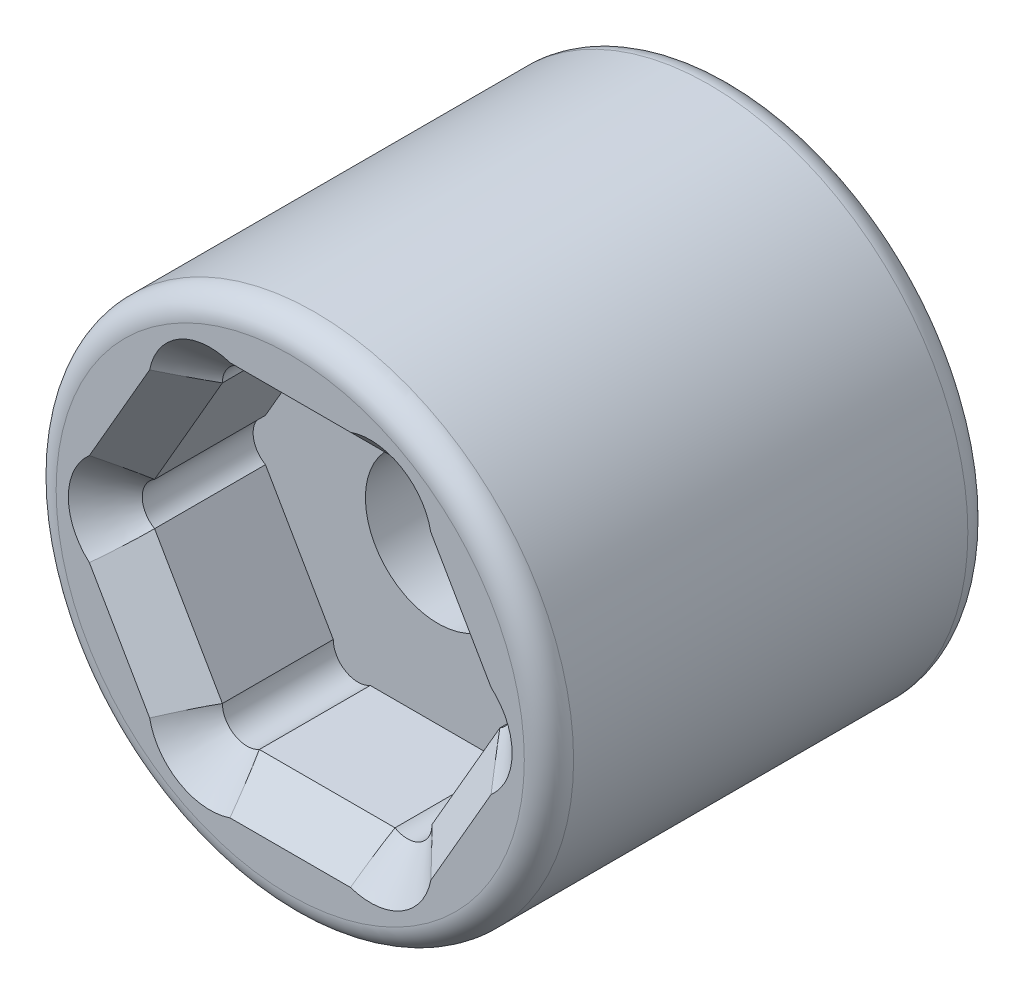
ISO-10303-21;
HEADER;
FILE_DESCRIPTION(('STEP AP214'),'2;1');
FILE_NAME('part.step','',(''),(''),'','','');
FILE_SCHEMA(('AUTOMOTIVE_DESIGN { 1 0 10303 214 1 1 1 1 }'));
ENDSEC;
DATA;
#1=APPLICATION_CONTEXT('core data for automotive mechanical design processes');
#2=APPLICATION_PROTOCOL_DEFINITION('international standard','automotive_design',2000,#1);
#3=PRODUCT_CONTEXT('',#1,'mechanical');
#4=PRODUCT('Part','Part','',(#3));
#5=PRODUCT_RELATED_PRODUCT_CATEGORY('part','',(#4));
#6=PRODUCT_DEFINITION_FORMATION('','',#4);
#7=PRODUCT_DEFINITION_CONTEXT('part definition',#1,'design');
#8=PRODUCT_DEFINITION('design','',#6,#7);
#9=PRODUCT_DEFINITION_SHAPE('','',#8);
#10=(LENGTH_UNIT() NAMED_UNIT(*) SI_UNIT(.MILLI.,.METRE.));
#11=(NAMED_UNIT(*) PLANE_ANGLE_UNIT() SI_UNIT($,.RADIAN.));
#12=(NAMED_UNIT(*) SI_UNIT($,.STERADIAN.) SOLID_ANGLE_UNIT());
#13=UNCERTAINTY_MEASURE_WITH_UNIT(LENGTH_MEASURE(1.E-05),#10,'distance_accuracy_value','');
#14=(GEOMETRIC_REPRESENTATION_CONTEXT(3) GLOBAL_UNCERTAINTY_ASSIGNED_CONTEXT((#13)) GLOBAL_UNIT_ASSIGNED_CONTEXT((#10,
#11,#12)) REPRESENTATION_CONTEXT('',''));
#15=CARTESIAN_POINT('',(0.,0.,0.));
#16=DIRECTION('',(0.,0.,1.));
#17=DIRECTION('',(1.,0.,0.));
#18=AXIS2_PLACEMENT_3D('',#15,#16,#17);
#19=CARTESIAN_POINT('',(0.,0.,6.));
#20=DIRECTION('',(0.,0.,1.));
#21=DIRECTION('',(1.,0.,0.));
#22=AXIS2_PLACEMENT_3D('',#19,#20,#21);
#23=PLANE('',#22);
#24=CARTESIAN_POINT('',(0.,0.,6.));
#25=DIRECTION('',(0.,0.,1.));
#26=DIRECTION('',(1.,0.,0.));
#27=AXIS2_PLACEMENT_3D('',#24,#25,#26);
#28=CIRCLE('',#27,9.5);
#29=CARTESIAN_POINT('',(9.5,0.,6.));
#30=VERTEX_POINT('',#29);
#31=EDGE_CURVE('E259',#30,#30,#28,.T.);
#32=ORIENTED_EDGE('',*,*,#31,.T.);
#33=EDGE_LOOP('',(#32));
#34=FACE_BOUND('',#33,.T.);
#35=DIRECTION('',(1.,0.,0.));
#36=VECTOR('',#35,1.);
#37=CARTESIAN_POINT('',(0.,8.00000000000001,6.));
#38=LINE('',#37,#36);
#39=CARTESIAN_POINT('',(-2.44535877331225,8.00000000000001,6.));
#40=VERTEX_POINT('',#39);
#41=CARTESIAN_POINT('',(2.44535877331225,8.00000000000001,6.));
#42=VERTEX_POINT('',#41);
#43=EDGE_CURVE('E208',#40,#42,#38,.T.);
#44=ORIENTED_EDGE('',*,*,#43,.T.);
#45=CARTESIAN_POINT('',(3.25277674973257,5.63397459621556,6.));
#46=DIRECTION('',(0.,0.,1.));
#47=DIRECTION('',(1.,0.,0.));
#48=AXIS2_PLACEMENT_3D('',#45,#46,#47);
#49=CIRCLE('',#48,2.50000000000001);
#50=CARTESIAN_POINT('',(5.70552384361939,6.11774281905556,6.));
#51=VERTEX_POINT('',#50);
#52=EDGE_CURVE('E230',#42,#51,#49,.F.);
#53=ORIENTED_EDGE('',*,*,#52,.T.);
#54=DIRECTION('',(0.5,-0.866025403784439,0.));
#55=VECTOR('',#54,1.);
#56=CARTESIAN_POINT('',(6.92820323027551,4.00000000000001,6.));
#57=LINE('',#56,#55);
#58=CARTESIAN_POINT('',(8.15088261693164,1.88225718094445,6.));
#59=VERTEX_POINT('',#58);
#60=EDGE_CURVE('E228',#51,#59,#57,.T.);
#61=ORIENTED_EDGE('',*,*,#60,.T.);
#62=CARTESIAN_POINT('',(6.50555349946513,0.,6.));
#63=DIRECTION('',(0.,0.,1.));
#64=DIRECTION('',(1.,0.,0.));
#65=AXIS2_PLACEMENT_3D('',#62,#63,#64);
#66=CIRCLE('',#65,2.50000000000001);
#67=CARTESIAN_POINT('',(8.15088261693164,-1.88225718094445,6.));
#68=VERTEX_POINT('',#67);
#69=EDGE_CURVE('E226',#59,#68,#66,.F.);
#70=ORIENTED_EDGE('',*,*,#69,.T.);
#71=DIRECTION('',(-0.5,-0.866025403784439,0.));
#72=VECTOR('',#71,1.);
#73=CARTESIAN_POINT('',(6.92820323027552,-4.,6.));
#74=LINE('',#73,#72);
#75=CARTESIAN_POINT('',(5.7055238436194,-6.11774281905555,6.));
#76=VERTEX_POINT('',#75);
#77=EDGE_CURVE('E224',#68,#76,#74,.T.);
#78=ORIENTED_EDGE('',*,*,#77,.T.);
#79=CARTESIAN_POINT('',(3.25277674973257,-5.63397459621556,6.));
#80=DIRECTION('',(0.,0.,1.));
#81=DIRECTION('',(1.,0.,0.));
#82=AXIS2_PLACEMENT_3D('',#79,#80,#81);
#83=CIRCLE('',#82,2.50000000000001);
#84=CARTESIAN_POINT('',(2.44535877331225,-8.00000000000001,6.));
#85=VERTEX_POINT('',#84);
#86=EDGE_CURVE('E222',#76,#85,#83,.F.);
#87=ORIENTED_EDGE('',*,*,#86,.T.);
#88=DIRECTION('',(-1.,0.,0.));
#89=VECTOR('',#88,1.);
#90=CARTESIAN_POINT('',(0.,-8.00000000000001,6.));
#91=LINE('',#90,#89);
#92=CARTESIAN_POINT('',(-2.44535877331224,-8.00000000000001,6.));
#93=VERTEX_POINT('',#92);
#94=EDGE_CURVE('E220',#85,#93,#91,.T.);
#95=ORIENTED_EDGE('',*,*,#94,.T.);
#96=CARTESIAN_POINT('',(-3.25277674973256,-5.63397459621556,6.));
#97=DIRECTION('',(0.,0.,1.));
#98=DIRECTION('',(1.,0.,0.));
#99=AXIS2_PLACEMENT_3D('',#96,#97,#98);
#100=CIRCLE('',#99,2.50000000000001);
#101=CARTESIAN_POINT('',(-5.70552384361939,-6.11774281905556,6.));
#102=VERTEX_POINT('',#101);
#103=EDGE_CURVE('E218',#93,#102,#100,.F.);
#104=ORIENTED_EDGE('',*,*,#103,.T.);
#105=DIRECTION('',(-0.5,0.866025403784439,0.));
#106=VECTOR('',#105,1.);
#107=CARTESIAN_POINT('',(-6.92820323027552,-4.00000000000001,6.));
#108=LINE('',#107,#106);
#109=CARTESIAN_POINT('',(-8.15088261693163,-1.88225718094446,6.));
#110=VERTEX_POINT('',#109);
#111=EDGE_CURVE('E216',#102,#110,#108,.T.);
#112=ORIENTED_EDGE('',*,*,#111,.T.);
#113=CARTESIAN_POINT('',(-6.50555349946513,0.,6.));
#114=DIRECTION('',(0.,0.,1.));
#115=DIRECTION('',(1.,0.,0.));
#116=AXIS2_PLACEMENT_3D('',#113,#114,#115);
#117=CIRCLE('',#116,2.50000000000001);
#118=CARTESIAN_POINT('',(-8.15088261693164,1.88225718094444,6.));
#119=VERTEX_POINT('',#118);
#120=EDGE_CURVE('E214',#110,#119,#117,.F.);
#121=ORIENTED_EDGE('',*,*,#120,.T.);
#122=DIRECTION('',(0.5,0.866025403784439,0.));
#123=VECTOR('',#122,1.);
#124=CARTESIAN_POINT('',(-6.92820323027552,4.,6.));
#125=LINE('',#124,#123);
#126=CARTESIAN_POINT('',(-5.70552384361939,6.11774281905556,6.));
#127=VERTEX_POINT('',#126);
#128=EDGE_CURVE('E212',#119,#127,#125,.T.);
#129=ORIENTED_EDGE('',*,*,#128,.T.);
#130=CARTESIAN_POINT('',(-3.25277674973257,5.63397459621556,6.));
#131=DIRECTION('',(0.,0.,1.));
#132=DIRECTION('',(1.,0.,0.));
#133=AXIS2_PLACEMENT_3D('',#130,#131,#132);
#134=CIRCLE('',#133,2.50000000000001);
#135=EDGE_CURVE('E210',#127,#40,#134,.F.);
#136=ORIENTED_EDGE('',*,*,#135,.T.);
#137=EDGE_LOOP('',(#44,#53,#61,#70,#78,#87,#95,#104,#112,#121,#129,#136));
#138=FACE_BOUND('',#137,.T.);
#139=ADVANCED_FACE('F34',(#34,#138),#23,.T.);
#140=CARTESIAN_POINT('',(0.,0.,6.));
#141=DIRECTION('',(0.,0.,-1.));
#142=DIRECTION('',(-1.,0.,0.));
#143=AXIS2_PLACEMENT_3D('',#140,#141,#142);
#144=CYLINDRICAL_SURFACE('',#143,10.5);
#145=CARTESIAN_POINT('',(0.,0.,5.));
#146=DIRECTION('',(0.,0.,1.));
#147=DIRECTION('',(1.,0.,0.));
#148=AXIS2_PLACEMENT_3D('',#145,#146,#147);
#149=CIRCLE('',#148,10.5);
#150=CARTESIAN_POINT('',(10.5,0.,5.));
#151=VERTEX_POINT('',#150);
#152=EDGE_CURVE('E42',#151,#151,#149,.F.);
#153=ORIENTED_EDGE('',*,*,#152,.T.);
#154=EDGE_LOOP('',(#153));
#155=FACE_BOUND('',#154,.T.);
#156=CARTESIAN_POINT('',(0.,0.,-11.));
#157=DIRECTION('',(0.,0.,-1.));
#158=DIRECTION('',(-1.,0.,0.));
#159=AXIS2_PLACEMENT_3D('',#156,#157,#158);
#160=CIRCLE('',#159,10.5);
#161=CARTESIAN_POINT('',(-10.5,0.,-11.));
#162=VERTEX_POINT('',#161);
#163=EDGE_CURVE('E396',#162,#162,#160,.F.);
#164=ORIENTED_EDGE('',*,*,#163,.T.);
#165=EDGE_LOOP('',(#164));
#166=FACE_BOUND('',#165,.T.);
#167=ADVANCED_FACE('F401',(#155,#166),#144,.T.);
#168=CARTESIAN_POINT('',(-3.25277674973257,5.63397459621556,6.));
#169=DIRECTION('',(0.,0.,-1.));
#170=DIRECTION('',(-1.,0.,0.));
#171=AXIS2_PLACEMENT_3D('',#168,#169,#170);
#172=CYLINDRICAL_SURFACE('',#171,1.);
#173=DIRECTION('',(0.,0.,-1.));
#174=VECTOR('',#173,1.);
#175=CARTESIAN_POINT('',(-2.75277674973257,6.5,6.));
#176=LINE('',#175,#174);
#177=CARTESIAN_POINT('',(-2.75277674973257,6.5,4.5));
#178=VERTEX_POINT('',#177);
#179=CARTESIAN_POINT('',(-2.75277674973257,6.5,0.));
#180=VERTEX_POINT('',#179);
#181=EDGE_CURVE('E158',#178,#180,#176,.T.);
#182=ORIENTED_EDGE('',*,*,#181,.F.);
#183=CARTESIAN_POINT('',(-3.25277674973257,5.63397459621556,4.5));
#184=DIRECTION('',(0.,0.,1.));
#185=DIRECTION('',(1.,0.,0.));
#186=AXIS2_PLACEMENT_3D('',#183,#184,#185);
#187=CIRCLE('',#186,1.);
#188=CARTESIAN_POINT('',(-4.25277674973257,5.63397459621556,4.5));
#189=VERTEX_POINT('',#188);
#190=EDGE_CURVE('E56',#178,#189,#187,.T.);
#191=ORIENTED_EDGE('',*,*,#190,.T.);
#192=DIRECTION('',(0.,0.,-1.));
#193=VECTOR('',#192,1.);
#194=CARTESIAN_POINT('',(-4.25277674973257,5.63397459621556,6.));
#195=LINE('',#194,#193);
#196=CARTESIAN_POINT('',(-4.25277674973257,5.63397459621556,0.));
#197=VERTEX_POINT('',#196);
#198=EDGE_CURVE('E169',#189,#197,#195,.T.);
#199=ORIENTED_EDGE('',*,*,#198,.T.);
#200=CARTESIAN_POINT('',(-3.25277674973257,5.63397459621556,0.));
#201=DIRECTION('',(0.,0.,1.));
#202=DIRECTION('',(-1.,0.,0.));
#203=AXIS2_PLACEMENT_3D('',#200,#201,#202);
#204=CIRCLE('',#203,1.);
#205=EDGE_CURVE('E167',#180,#197,#204,.T.);
#206=ORIENTED_EDGE('',*,*,#205,.F.);
#207=EDGE_LOOP('',(#182,#191,#199,#206));
#208=FACE_BOUND('',#207,.T.);
#209=ADVANCED_FACE('F168',(#208),#172,.F.);
#210=CARTESIAN_POINT('',(-7.00555349946513,0.866025403784436,6.));
#211=DIRECTION('',(0.866025403784439,-0.5,0.));
#212=DIRECTION('',(0.5,0.866025403784439,0.));
#213=AXIS2_PLACEMENT_3D('',#210,#211,#212);
#214=PLANE('',#213);
#215=ORIENTED_EDGE('',*,*,#198,.F.);
#216=DIRECTION('',(-0.5,-0.866025403784439,0.));
#217=VECTOR('',#216,1.);
#218=CARTESIAN_POINT('',(-7.00555349946513,0.866025403784436,4.5));
#219=LINE('',#218,#217);
#220=CARTESIAN_POINT('',(-7.00555349946513,0.866025403784436,4.5));
#221=VERTEX_POINT('',#220);
#222=EDGE_CURVE('E249',#189,#221,#219,.T.);
#223=ORIENTED_EDGE('',*,*,#222,.T.);
#224=DIRECTION('',(0.,0.,-1.));
#225=VECTOR('',#224,1.);
#226=CARTESIAN_POINT('',(-7.00555349946513,0.866025403784436,6.));
#227=LINE('',#226,#225);
#228=CARTESIAN_POINT('',(-7.00555349946513,0.866025403784436,0.));
#229=VERTEX_POINT('',#228);
#230=EDGE_CURVE('E202',#221,#229,#227,.T.);
#231=ORIENTED_EDGE('',*,*,#230,.T.);
#232=DIRECTION('',(-0.5,-0.866025403784439,0.));
#233=VECTOR('',#232,1.);
#234=CARTESIAN_POINT('',(-7.00555349946513,0.866025403784436,0.));
#235=LINE('',#234,#233);
#236=EDGE_CURVE('E173',#197,#229,#235,.T.);
#237=ORIENTED_EDGE('',*,*,#236,.F.);
#238=EDGE_LOOP('',(#215,#223,#231,#237));
#239=FACE_BOUND('',#238,.T.);
#240=ADVANCED_FACE('F677',(#239),#214,.T.);
#241=CARTESIAN_POINT('',(-6.50555349946513,0.,6.));
#242=DIRECTION('',(0.,0.,-1.));
#243=DIRECTION('',(-1.,0.,0.));
#244=AXIS2_PLACEMENT_3D('',#241,#242,#243);
#245=CYLINDRICAL_SURFACE('',#244,1.);
#246=ORIENTED_EDGE('',*,*,#230,.F.);
#247=CARTESIAN_POINT('',(-6.50555349946513,0.,4.5));
#248=DIRECTION('',(0.,0.,1.));
#249=DIRECTION('',(1.,0.,0.));
#250=AXIS2_PLACEMENT_3D('',#247,#248,#249);
#251=CIRCLE('',#250,1.);
#252=CARTESIAN_POINT('',(-7.00555349946513,-0.866025403784446,4.5));
#253=VERTEX_POINT('',#252);
#254=EDGE_CURVE('E247',#221,#253,#251,.T.);
#255=ORIENTED_EDGE('',*,*,#254,.T.);
#256=DIRECTION('',(0.,0.,-1.));
#257=VECTOR('',#256,1.);
#258=CARTESIAN_POINT('',(-7.00555349946513,-0.866025403784446,6.));
#259=LINE('',#258,#257);
#260=CARTESIAN_POINT('',(-7.00555349946513,-0.866025403784446,0.));
#261=VERTEX_POINT('',#260);
#262=EDGE_CURVE('E200',#253,#261,#259,.T.);
#263=ORIENTED_EDGE('',*,*,#262,.T.);
#264=CARTESIAN_POINT('',(-6.50555349946513,0.,0.));
#265=DIRECTION('',(0.,0.,1.));
#266=DIRECTION('',(-1.,0.,0.));
#267=AXIS2_PLACEMENT_3D('',#264,#265,#266);
#268=CIRCLE('',#267,1.);
#269=EDGE_CURVE('E723',#229,#261,#268,.T.);
#270=ORIENTED_EDGE('',*,*,#269,.F.);
#271=EDGE_LOOP('',(#246,#255,#263,#270));
#272=FACE_BOUND('',#271,.T.);
#273=ADVANCED_FACE('F668',(#272),#245,.F.);
#274=CARTESIAN_POINT('',(-4.25277674973256,-5.63397459621556,6.));
#275=DIRECTION('',(0.866025403784439,0.5,0.));
#276=DIRECTION('',(-0.5,0.866025403784439,0.));
#277=AXIS2_PLACEMENT_3D('',#274,#275,#276);
#278=PLANE('',#277);
#279=ORIENTED_EDGE('',*,*,#262,.F.);
#280=DIRECTION('',(0.5,-0.866025403784439,0.));
#281=VECTOR('',#280,1.);
#282=CARTESIAN_POINT('',(-4.25277674973256,-5.63397459621556,4.5));
#283=LINE('',#282,#281);
#284=CARTESIAN_POINT('',(-4.25277674973256,-5.63397459621556,4.5));
#285=VERTEX_POINT('',#284);
#286=EDGE_CURVE('E245',#253,#285,#283,.T.);
#287=ORIENTED_EDGE('',*,*,#286,.T.);
#288=DIRECTION('',(0.,0.,-1.));
#289=VECTOR('',#288,1.);
#290=CARTESIAN_POINT('',(-4.25277674973256,-5.63397459621556,6.));
#291=LINE('',#290,#289);
#292=CARTESIAN_POINT('',(-4.25277674973256,-5.63397459621556,0.));
#293=VERTEX_POINT('',#292);
#294=EDGE_CURVE('E198',#285,#293,#291,.T.);
#295=ORIENTED_EDGE('',*,*,#294,.T.);
#296=DIRECTION('',(0.5,-0.866025403784438,0.));
#297=VECTOR('',#296,1.);
#298=CARTESIAN_POINT('',(-4.25277674973256,-5.63397459621556,0.));
#299=LINE('',#298,#297);
#300=EDGE_CURVE('E725',#261,#293,#299,.T.);
#301=ORIENTED_EDGE('',*,*,#300,.F.);
#302=EDGE_LOOP('',(#279,#287,#295,#301));
#303=FACE_BOUND('',#302,.T.);
#304=ADVANCED_FACE('F659',(#303),#278,.T.);
#305=CARTESIAN_POINT('',(-3.25277674973256,-5.63397459621556,6.));
#306=DIRECTION('',(0.,0.,-1.));
#307=DIRECTION('',(-1.,0.,0.));
#308=AXIS2_PLACEMENT_3D('',#305,#306,#307);
#309=CYLINDRICAL_SURFACE('',#308,1.);
#310=ORIENTED_EDGE('',*,*,#294,.F.);
#311=CARTESIAN_POINT('',(-3.25277674973256,-5.63397459621556,4.5));
#312=DIRECTION('',(0.,0.,1.));
#313=DIRECTION('',(1.,0.,0.));
#314=AXIS2_PLACEMENT_3D('',#311,#312,#313);
#315=CIRCLE('',#314,1.);
#316=CARTESIAN_POINT('',(-2.75277674973256,-6.5,4.5));
#317=VERTEX_POINT('',#316);
#318=EDGE_CURVE('E243',#285,#317,#315,.T.);
#319=ORIENTED_EDGE('',*,*,#318,.T.);
#320=DIRECTION('',(0.,0.,-1.));
#321=VECTOR('',#320,1.);
#322=CARTESIAN_POINT('',(-2.75277674973256,-6.5,6.));
#323=LINE('',#322,#321);
#324=CARTESIAN_POINT('',(-2.75277674973256,-6.5,0.));
#325=VERTEX_POINT('',#324);
#326=EDGE_CURVE('E196',#317,#325,#323,.T.);
#327=ORIENTED_EDGE('',*,*,#326,.T.);
#328=CARTESIAN_POINT('',(-3.25277674973256,-5.63397459621556,0.));
#329=DIRECTION('',(0.,0.,1.));
#330=DIRECTION('',(-1.,0.,0.));
#331=AXIS2_PLACEMENT_3D('',#328,#329,#330);
#332=CIRCLE('',#331,1.);
#333=EDGE_CURVE('E731',#293,#325,#332,.T.);
#334=ORIENTED_EDGE('',*,*,#333,.F.);
#335=EDGE_LOOP('',(#310,#319,#327,#334));
#336=FACE_BOUND('',#335,.T.);
#337=ADVANCED_FACE('F650',(#336),#309,.F.);
#338=CARTESIAN_POINT('',(2.75277674973257,-6.5,6.));
#339=DIRECTION('',(0.,1.,0.));
#340=DIRECTION('',(-1.,0.,0.));
#341=AXIS2_PLACEMENT_3D('',#338,#339,#340);
#342=PLANE('',#341);
#343=ORIENTED_EDGE('',*,*,#326,.F.);
#344=DIRECTION('',(1.,0.,0.));
#345=VECTOR('',#344,1.);
#346=CARTESIAN_POINT('',(2.75277674973257,-6.5,4.5));
#347=LINE('',#346,#345);
#348=CARTESIAN_POINT('',(2.75277674973257,-6.5,4.5));
#349=VERTEX_POINT('',#348);
#350=EDGE_CURVE('E241',#317,#349,#347,.T.);
#351=ORIENTED_EDGE('',*,*,#350,.T.);
#352=DIRECTION('',(0.,0.,-1.));
#353=VECTOR('',#352,1.);
#354=CARTESIAN_POINT('',(2.75277674973257,-6.5,6.));
#355=LINE('',#354,#353);
#356=CARTESIAN_POINT('',(2.75277674973257,-6.5,0.));
#357=VERTEX_POINT('',#356);
#358=EDGE_CURVE('E194',#349,#357,#355,.T.);
#359=ORIENTED_EDGE('',*,*,#358,.T.);
#360=DIRECTION('',(1.,0.,0.));
#361=VECTOR('',#360,1.);
#362=CARTESIAN_POINT('',(2.75277674973257,-6.5,0.));
#363=LINE('',#362,#361);
#364=EDGE_CURVE('E734',#325,#357,#363,.T.);
#365=ORIENTED_EDGE('',*,*,#364,.F.);
#366=EDGE_LOOP('',(#343,#351,#359,#365));
#367=FACE_BOUND('',#366,.T.);
#368=ADVANCED_FACE('F641',(#367),#342,.T.);
#369=CARTESIAN_POINT('',(3.25277674973257,-5.63397459621556,6.));
#370=DIRECTION('',(0.,0.,-1.));
#371=DIRECTION('',(-1.,0.,0.));
#372=AXIS2_PLACEMENT_3D('',#369,#370,#371);
#373=CYLINDRICAL_SURFACE('',#372,1.);
#374=ORIENTED_EDGE('',*,*,#358,.F.);
#375=CARTESIAN_POINT('',(3.25277674973257,-5.63397459621556,4.5));
#376=DIRECTION('',(0.,0.,1.));
#377=DIRECTION('',(1.,0.,0.));
#378=AXIS2_PLACEMENT_3D('',#375,#376,#377);
#379=CIRCLE('',#378,1.);
#380=CARTESIAN_POINT('',(4.25277674973257,-5.63397459621556,4.5));
#381=VERTEX_POINT('',#380);
#382=EDGE_CURVE('E239',#349,#381,#379,.T.);
#383=ORIENTED_EDGE('',*,*,#382,.T.);
#384=DIRECTION('',(0.,0.,-1.));
#385=VECTOR('',#384,1.);
#386=CARTESIAN_POINT('',(4.25277674973257,-5.63397459621556,6.));
#387=LINE('',#386,#385);
#388=CARTESIAN_POINT('',(4.25277674973257,-5.63397459621556,0.));
#389=VERTEX_POINT('',#388);
#390=EDGE_CURVE('E192',#381,#389,#387,.T.);
#391=ORIENTED_EDGE('',*,*,#390,.T.);
#392=CARTESIAN_POINT('',(3.25277674973257,-5.63397459621556,0.));
#393=DIRECTION('',(0.,0.,1.));
#394=DIRECTION('',(-1.,0.,0.));
#395=AXIS2_PLACEMENT_3D('',#392,#393,#394);
#396=CIRCLE('',#395,1.);
#397=EDGE_CURVE('E737',#357,#389,#396,.T.);
#398=ORIENTED_EDGE('',*,*,#397,.F.);
#399=EDGE_LOOP('',(#374,#383,#391,#398));
#400=FACE_BOUND('',#399,.T.);
#401=ADVANCED_FACE('F632',(#400),#373,.F.);
#402=CARTESIAN_POINT('',(7.00555349946513,-0.866025403784438,6.));
#403=DIRECTION('',(-0.866025403784439,0.5,0.));
#404=DIRECTION('',(-0.5,-0.866025403784439,0.));
#405=AXIS2_PLACEMENT_3D('',#402,#403,#404);
#406=PLANE('',#405);
#407=ORIENTED_EDGE('',*,*,#390,.F.);
#408=DIRECTION('',(0.5,0.866025403784439,0.));
#409=VECTOR('',#408,1.);
#410=CARTESIAN_POINT('',(7.00555349946513,-0.866025403784438,4.5));
#411=LINE('',#410,#409);
#412=CARTESIAN_POINT('',(7.00555349946513,-0.866025403784438,4.5));
#413=VERTEX_POINT('',#412);
#414=EDGE_CURVE('E237',#381,#413,#411,.T.);
#415=ORIENTED_EDGE('',*,*,#414,.T.);
#416=DIRECTION('',(0.,0.,-1.));
#417=VECTOR('',#416,1.);
#418=CARTESIAN_POINT('',(7.00555349946513,-0.866025403784438,6.));
#419=LINE('',#418,#417);
#420=CARTESIAN_POINT('',(7.00555349946513,-0.866025403784438,0.));
#421=VERTEX_POINT('',#420);
#422=EDGE_CURVE('E190',#413,#421,#419,.T.);
#423=ORIENTED_EDGE('',*,*,#422,.T.);
#424=DIRECTION('',(0.5,0.866025403784439,0.));
#425=VECTOR('',#424,1.);
#426=CARTESIAN_POINT('',(7.00555349946513,-0.866025403784438,0.));
#427=LINE('',#426,#425);
#428=EDGE_CURVE('E740',#389,#421,#427,.T.);
#429=ORIENTED_EDGE('',*,*,#428,.F.);
#430=EDGE_LOOP('',(#407,#415,#423,#429));
#431=FACE_BOUND('',#430,.T.);
#432=ADVANCED_FACE('F623',(#431),#406,.T.);
#433=CARTESIAN_POINT('',(6.50555349946513,0.,6.));
#434=DIRECTION('',(0.,0.,-1.));
#435=DIRECTION('',(-1.,0.,0.));
#436=AXIS2_PLACEMENT_3D('',#433,#434,#435);
#437=CYLINDRICAL_SURFACE('',#436,1.);
#438=ORIENTED_EDGE('',*,*,#422,.F.);
#439=CARTESIAN_POINT('',(6.50555349946513,0.,4.5));
#440=DIRECTION('',(0.,0.,1.));
#441=DIRECTION('',(1.,0.,0.));
#442=AXIS2_PLACEMENT_3D('',#439,#440,#441);
#443=CIRCLE('',#442,1.);
#444=CARTESIAN_POINT('',(7.00555349946513,0.866025403784443,4.5));
#445=VERTEX_POINT('',#444);
#446=EDGE_CURVE('E235',#413,#445,#443,.T.);
#447=ORIENTED_EDGE('',*,*,#446,.T.);
#448=DIRECTION('',(0.,0.,-1.));
#449=VECTOR('',#448,1.);
#450=CARTESIAN_POINT('',(7.00555349946513,0.866025403784443,6.));
#451=LINE('',#450,#449);
#452=CARTESIAN_POINT('',(7.00555349946513,0.866025403784443,0.));
#453=VERTEX_POINT('',#452);
#454=EDGE_CURVE('E188',#445,#453,#451,.T.);
#455=ORIENTED_EDGE('',*,*,#454,.T.);
#456=CARTESIAN_POINT('',(6.50555349946513,0.,0.));
#457=DIRECTION('',(0.,0.,1.));
#458=DIRECTION('',(-1.,0.,0.));
#459=AXIS2_PLACEMENT_3D('',#456,#457,#458);
#460=CIRCLE('',#459,1.);
#461=EDGE_CURVE('E743',#421,#453,#460,.T.);
#462=ORIENTED_EDGE('',*,*,#461,.F.);
#463=EDGE_LOOP('',(#438,#447,#455,#462));
#464=FACE_BOUND('',#463,.T.);
#465=ADVANCED_FACE('F615',(#464),#437,.F.);
#466=CARTESIAN_POINT('',(4.25277674973257,5.63397459621556,6.));
#467=DIRECTION('',(-0.866025403784439,-0.5,0.));
#468=DIRECTION('',(0.5,-0.866025403784439,0.));
#469=AXIS2_PLACEMENT_3D('',#466,#467,#468);
#470=PLANE('',#469);
#471=ORIENTED_EDGE('',*,*,#454,.F.);
#472=DIRECTION('',(-0.5,0.866025403784439,0.));
#473=VECTOR('',#472,1.);
#474=CARTESIAN_POINT('',(4.25277674973257,5.63397459621556,4.5));
#475=LINE('',#474,#473);
#476=CARTESIAN_POINT('',(4.25277674973257,5.63397459621556,4.5));
#477=VERTEX_POINT('',#476);
#478=EDGE_CURVE('E233',#445,#477,#475,.T.);
#479=ORIENTED_EDGE('',*,*,#478,.T.);
#480=DIRECTION('',(0.,0.,-1.));
#481=VECTOR('',#480,1.);
#482=CARTESIAN_POINT('',(4.25277674973257,5.63397459621556,6.));
#483=LINE('',#482,#481);
#484=CARTESIAN_POINT('',(4.25277674973257,5.63397459621556,0.));
#485=VERTEX_POINT('',#484);
#486=EDGE_CURVE('E186',#477,#485,#483,.T.);
#487=ORIENTED_EDGE('',*,*,#486,.T.);
#488=DIRECTION('',(-0.5,0.866025403784438,0.));
#489=VECTOR('',#488,1.);
#490=CARTESIAN_POINT('',(4.25277674973257,5.63397459621556,0.));
#491=LINE('',#490,#489);
#492=EDGE_CURVE('E181',#453,#485,#491,.T.);
#493=ORIENTED_EDGE('',*,*,#492,.F.);
#494=EDGE_LOOP('',(#471,#479,#487,#493));
#495=FACE_BOUND('',#494,.T.);
#496=ADVANCED_FACE('F607',(#495),#470,.T.);
#497=CARTESIAN_POINT('',(3.25277674973257,5.63397459621556,6.));
#498=DIRECTION('',(0.,0.,-1.));
#499=DIRECTION('',(-1.,0.,0.));
#500=AXIS2_PLACEMENT_3D('',#497,#498,#499);
#501=CYLINDRICAL_SURFACE('',#500,1.);
#502=ORIENTED_EDGE('',*,*,#486,.F.);
#503=CARTESIAN_POINT('',(3.25277674973257,5.63397459621556,4.5));
#504=DIRECTION('',(0.,0.,1.));
#505=DIRECTION('',(1.,0.,0.));
#506=AXIS2_PLACEMENT_3D('',#503,#504,#505);
#507=CIRCLE('',#506,1.);
#508=CARTESIAN_POINT('',(2.75277674973256,6.5,4.5));
#509=VERTEX_POINT('',#508);
#510=EDGE_CURVE('E205',#477,#509,#507,.T.);
#511=ORIENTED_EDGE('',*,*,#510,.T.);
#512=DIRECTION('',(0.,0.,-1.));
#513=VECTOR('',#512,1.);
#514=CARTESIAN_POINT('',(2.75277674973256,6.5,6.));
#515=LINE('',#514,#513);
#516=CARTESIAN_POINT('',(2.75277674973256,6.5,0.));
#517=VERTEX_POINT('',#516);
#518=EDGE_CURVE('E164',#509,#517,#515,.T.);
#519=ORIENTED_EDGE('',*,*,#518,.T.);
#520=CARTESIAN_POINT('',(3.25277674973257,5.63397459621556,0.));
#521=DIRECTION('',(0.,0.,1.));
#522=DIRECTION('',(-1.,0.,0.));
#523=AXIS2_PLACEMENT_3D('',#520,#521,#522);
#524=CIRCLE('',#523,1.);
#525=EDGE_CURVE('E179',#485,#517,#524,.T.);
#526=ORIENTED_EDGE('',*,*,#525,.F.);
#527=EDGE_LOOP('',(#502,#511,#519,#526));
#528=FACE_BOUND('',#527,.T.);
#529=ADVANCED_FACE('F424',(#528),#501,.F.);
#530=CARTESIAN_POINT('',(-2.75277674973257,6.5,6.));
#531=DIRECTION('',(0.,-1.,0.));
#532=DIRECTION('',(1.,0.,0.));
#533=AXIS2_PLACEMENT_3D('',#530,#531,#532);
#534=PLANE('',#533);
#535=ORIENTED_EDGE('',*,*,#518,.F.);
#536=DIRECTION('',(-1.,0.,0.));
#537=VECTOR('',#536,1.);
#538=CARTESIAN_POINT('',(-2.75277674973257,6.5,4.5));
#539=LINE('',#538,#537);
#540=EDGE_CURVE('E49',#509,#178,#539,.T.);
#541=ORIENTED_EDGE('',*,*,#540,.T.);
#542=ORIENTED_EDGE('',*,*,#181,.T.);
#543=DIRECTION('',(-1.,0.,0.));
#544=VECTOR('',#543,1.);
#545=CARTESIAN_POINT('',(-2.75277674973257,6.5,0.));
#546=LINE('',#545,#544);
#547=EDGE_CURVE('E162',#517,#180,#546,.T.);
#548=ORIENTED_EDGE('',*,*,#547,.F.);
#549=EDGE_LOOP('',(#535,#541,#542,#548));
#550=FACE_BOUND('',#549,.T.);
#551=ADVANCED_FACE('F160',(#550),#534,.T.);
#552=CARTESIAN_POINT('',(0.,0.,0.));
#553=DIRECTION('',(0.,0.,-1.));
#554=DIRECTION('',(-1.,0.,0.));
#555=AXIS2_PLACEMENT_3D('',#552,#553,#554);
#556=PLANE('',#555);
#557=CARTESIAN_POINT('',(0.,0.,0.));
#558=DIRECTION('',(0.,0.,-1.));
#559=DIRECTION('',(-1.,0.,0.));
#560=AXIS2_PLACEMENT_3D('',#557,#558,#559);
#561=CIRCLE('',#560,2.95);
#562=CARTESIAN_POINT('',(-2.95,0.,0.));
#563=VERTEX_POINT('',#562);
#564=EDGE_CURVE('E174',#563,#563,#561,.T.);
#565=ORIENTED_EDGE('',*,*,#564,.T.);
#566=EDGE_LOOP('',(#565));
#567=FACE_BOUND('',#566,.T.);
#568=ORIENTED_EDGE('',*,*,#547,.T.);
#569=ORIENTED_EDGE('',*,*,#205,.T.);
#570=ORIENTED_EDGE('',*,*,#236,.T.);
#571=ORIENTED_EDGE('',*,*,#269,.T.);
#572=ORIENTED_EDGE('',*,*,#300,.T.);
#573=ORIENTED_EDGE('',*,*,#333,.T.);
#574=ORIENTED_EDGE('',*,*,#364,.T.);
#575=ORIENTED_EDGE('',*,*,#397,.T.);
#576=ORIENTED_EDGE('',*,*,#428,.T.);
#577=ORIENTED_EDGE('',*,*,#461,.T.);
#578=ORIENTED_EDGE('',*,*,#492,.T.);
#579=ORIENTED_EDGE('',*,*,#525,.T.);
#580=EDGE_LOOP('',(#568,#569,#570,#571,#572,#573,#574,#575,#576,#577,#578,#579));
#581=FACE_BOUND('',#580,.T.);
#582=ADVANCED_FACE('F176',(#567,#581),#556,.F.);
#583=CARTESIAN_POINT('',(0.,0.,-12.));
#584=DIRECTION('',(0.,0.,-1.));
#585=DIRECTION('',(-1.,0.,0.));
#586=AXIS2_PLACEMENT_3D('',#583,#584,#585);
#587=PLANE('',#586);
#588=CARTESIAN_POINT('',(0.,0.,-12.));
#589=DIRECTION('',(0.,0.,-1.));
#590=DIRECTION('',(-1.,0.,0.));
#591=AXIS2_PLACEMENT_3D('',#588,#589,#590);
#592=CIRCLE('',#591,9.5);
#593=CARTESIAN_POINT('',(-9.5,0.,-12.));
#594=VERTEX_POINT('',#593);
#595=EDGE_CURVE('E11',#594,#594,#592,.T.);
#596=ORIENTED_EDGE('',*,*,#595,.T.);
#597=EDGE_LOOP('',(#596));
#598=FACE_BOUND('',#597,.T.);
#599=CARTESIAN_POINT('',(0.,0.,-12.));
#600=DIRECTION('',(0.,0.,-1.));
#601=DIRECTION('',(-1.,0.,0.));
#602=AXIS2_PLACEMENT_3D('',#599,#600,#601);
#603=CIRCLE('',#602,4.45000000000001);
#604=CARTESIAN_POINT('',(-4.45000000000001,0.,-12.));
#605=VERTEX_POINT('',#604);
#606=EDGE_CURVE('E256',#605,#605,#603,.F.);
#607=ORIENTED_EDGE('',*,*,#606,.T.);
#608=EDGE_LOOP('',(#607));
#609=FACE_BOUND('',#608,.T.);
#610=ADVANCED_FACE('F564',(#598,#609),#587,.T.);
#611=CARTESIAN_POINT('',(0.,0.,-12.));
#612=DIRECTION('',(0.,0.,1.));
#613=DIRECTION('',(1.,0.,0.));
#614=AXIS2_PLACEMENT_3D('',#611,#612,#613);
#615=CYLINDRICAL_SURFACE('',#614,2.95);
#616=CARTESIAN_POINT('',(0.,0.,-10.5));
#617=DIRECTION('',(0.,0.,-1.));
#618=DIRECTION('',(-1.,0.,0.));
#619=AXIS2_PLACEMENT_3D('',#616,#617,#618);
#620=CIRCLE('',#619,2.95);
#621=CARTESIAN_POINT('',(-2.95,0.,-10.5));
#622=VERTEX_POINT('',#621);
#623=EDGE_CURVE('E253',#622,#622,#620,.T.);
#624=ORIENTED_EDGE('',*,*,#623,.T.);
#625=EDGE_LOOP('',(#624));
#626=FACE_BOUND('',#625,.T.);
#627=ORIENTED_EDGE('',*,*,#564,.F.);
#628=EDGE_LOOP('',(#627));
#629=FACE_BOUND('',#628,.T.);
#630=ADVANCED_FACE('F557',(#626,#629),#615,.F.);
#631=CARTESIAN_POINT('',(-3.25277674973256,-5.63397459621556,4.5));
#632=DIRECTION('',(0.,0.,1.));
#633=DIRECTION('',(1.,0.,0.));
#634=AXIS2_PLACEMENT_3D('',#631,#632,#633);
#635=CONICAL_SURFACE('',#634,1.,0.785398163397451);
#636=CARTESIAN_POINT('',(-5.70552384361939,-6.11774281905556,6.));
#637=CARTESIAN_POINT('',(-5.58644091745472,-6.07307768459924,5.87453859355625));
#638=CARTESIAN_POINT('',(-5.4670479813788,-6.02905975245951,5.74913231181222));
#639=CARTESIAN_POINT('',(-5.22742885588625,-5.94290772761776,5.49854004948219));
#640=CARTESIAN_POINT('',(-5.10720290253525,-5.90077312455152,5.3733540181529));
#641=CARTESIAN_POINT('',(-4.86560593643624,-5.81894072294984,5.12320870723308));
#642=CARTESIAN_POINT('',(-4.74423461173995,-5.77924361175223,4.99824950115631));
#643=CARTESIAN_POINT('',(-4.56099064313509,-5.72237484505351,4.81112118590487));
#644=CARTESIAN_POINT('',(-4.4997029278572,-5.70386236334594,4.74878822668052));
#645=CARTESIAN_POINT('',(-4.37663391158724,-5.6679894028849,4.62427085194145));
#646=CARTESIAN_POINT('',(-4.31485257868029,-5.65062899930558,4.56208644637471));
#647=CARTESIAN_POINT('',(-4.25277674973923,-5.63397459620144,4.49999999999871));
#648=B_SPLINE_CURVE_WITH_KNOTS('',3,(#636,#637,#638,#639,#640,#641,#642,#643,#644,#645,#646,
#647),.UNSPECIFIED.,.F.,.F.,(4,2,2,2,2,4),(0.,0.535961030249364,1.07177592853622,
1.60774123156814,1.87579807195305,2.14387238612531),.UNSPECIFIED.);
#649=EDGE_CURVE('E372',#102,#285,#648,.T.);
#650=ORIENTED_EDGE('',*,*,#649,.F.);
#651=ORIENTED_EDGE('',*,*,#103,.F.);
#652=CARTESIAN_POINT('',(-2.44535877331224,-8.00000000000001,6.));
#653=CARTESIAN_POINT('',(-2.46621909529195,-7.87453859355626,5.87453859355625));
#654=CARTESIAN_POINT('',(-2.48779491587485,-7.74913231181223,5.74913231181222));
#655=CARTESIAN_POINT('',(-2.5329946365207,-7.4985400494822,5.49854004948219));
#656=CARTESIAN_POINT('',(-2.55661797656246,-7.3733540181529,5.3733540181529));
#657=CARTESIAN_POINT('',(-2.60654752097222,-7.12320870723308,5.12320870723308));
#658=CARTESIAN_POINT('',(-2.63285447656638,-6.99824950115632,4.99824950115631));
#659=CARTESIAN_POINT('',(-2.67522666422583,-6.81112118590487,4.81112118590487));
#660=CARTESIAN_POINT('',(-2.68983824241892,-6.74878822668052,4.74878822668052));
#661=CARTESIAN_POINT('',(-2.72030585548569,-6.62427085194145,4.62427085194145));
#662=CARTESIAN_POINT('',(-2.73616197141952,-6.56208644637471,4.56208644637471));
#663=CARTESIAN_POINT('',(-2.752776749717,-6.49999999999871,4.49999999999871));
#664=B_SPLINE_CURVE_WITH_KNOTS('',3,(#652,#653,#654,#655,#656,#657,#658,#659,#660,#661,#662,
#663),.UNSPECIFIED.,.F.,.F.,(4,2,2,2,2,4),(0.,0.535961030249365,1.07177592853622,
1.60774123156814,1.87579807195305,2.14387238612531),.UNSPECIFIED.);
#665=EDGE_CURVE('E387',#317,#93,#664,.F.);
#666=ORIENTED_EDGE('',*,*,#665,.F.);
#667=ORIENTED_EDGE('',*,*,#318,.F.);
#668=EDGE_LOOP('',(#650,#651,#666,#667));
#669=FACE_BOUND('',#668,.T.);
#670=ADVANCED_FACE('F382',(#669),#635,.F.);
#671=CARTESIAN_POINT('',(2.75277674973257,-6.5,4.5));
#672=DIRECTION('',(0.,-0.707106781186546,-0.707106781186549));
#673=DIRECTION('',(1.,0.,0.));
#674=AXIS2_PLACEMENT_3D('',#671,#672,#673);
#675=PLANE('',#674);
#676=ORIENTED_EDGE('',*,*,#665,.T.);
#677=ORIENTED_EDGE('',*,*,#94,.F.);
#678=CARTESIAN_POINT('',(2.44535877331225,-8.00000000000001,6.));
#679=CARTESIAN_POINT('',(2.46621909529195,-7.87453859355625,5.87453859355625));
#680=CARTESIAN_POINT('',(2.48779491587485,-7.74913231181223,5.74913231181222));
#681=CARTESIAN_POINT('',(2.5329946365207,-7.49854004948219,5.49854004948219));
#682=CARTESIAN_POINT('',(2.55661797656246,-7.3733540181529,5.3733540181529));
#683=CARTESIAN_POINT('',(2.60654752097223,-7.12320870723308,5.12320870723308));
#684=CARTESIAN_POINT('',(2.63285447656639,-6.99824950115632,4.99824950115631));
#685=CARTESIAN_POINT('',(2.67522666422583,-6.81112118590487,4.81112118590487));
#686=CARTESIAN_POINT('',(2.68983824241892,-6.74878822668052,4.74878822668052));
#687=CARTESIAN_POINT('',(2.72030585548569,-6.62427085194145,4.62427085194145));
#688=CARTESIAN_POINT('',(2.73616197141952,-6.56208644637471,4.56208644637471));
#689=CARTESIAN_POINT('',(2.75277674971701,-6.49999999999871,4.49999999999871));
#690=B_SPLINE_CURVE_WITH_KNOTS('',3,(#678,#679,#680,#681,#682,#683,#684,#685,#686,#687,#688,
#689),.UNSPECIFIED.,.F.,.F.,(4,2,2,2,2,4),(0.,0.535961030249365,1.07177592853622,
1.60774123156814,1.87579807195305,2.14387238612531),.UNSPECIFIED.);
#691=EDGE_CURVE('E365',#349,#85,#690,.F.);
#692=ORIENTED_EDGE('',*,*,#691,.F.);
#693=ORIENTED_EDGE('',*,*,#350,.F.);
#694=EDGE_LOOP('',(#676,#677,#692,#693));
#695=FACE_BOUND('',#694,.T.);
#696=ADVANCED_FACE('F379',(#695),#675,.F.);
#697=CARTESIAN_POINT('',(-4.25277674973256,-5.63397459621556,4.5));
#698=DIRECTION('',(-0.612372435695793,-0.353553390593273,-0.707106781186549));
#699=DIRECTION('',(0.5,-0.866025403784439,0.));
#700=AXIS2_PLACEMENT_3D('',#697,#698,#699);
#701=PLANE('',#700);
#702=ORIENTED_EDGE('',*,*,#649,.T.);
#703=ORIENTED_EDGE('',*,*,#286,.F.);
#704=CARTESIAN_POINT('',(-8.15088261693163,-1.88225718094446,6.));
#705=CARTESIAN_POINT('',(-8.05266001274667,-1.80146090895703,5.87453859355625));
#706=CARTESIAN_POINT('',(-7.95484289725365,-1.72007255935273,5.74913231181223));
#707=CARTESIAN_POINT('',(-7.76042349240695,-1.55563232186445,5.49854004948219));
#708=CARTESIAN_POINT('',(-7.66382087909771,-1.47258089360139,5.3733540181529));
#709=CARTESIAN_POINT('',(-7.47215345740847,-1.30426798428325,5.12320870723308));
#710=CARTESIAN_POINT('',(-7.37708908830634,-1.21900588940409,4.99824950115631));
#711=CARTESIAN_POINT('',(-7.23621730736092,-1.08874634085137,4.81112118590487));
#712=CARTESIAN_POINT('',(-7.18954117027612,-1.04492586333459,4.74878822668052));
#713=CARTESIAN_POINT('',(-7.09693976707293,-0.956281449056563,4.62427085194145));
#714=CARTESIAN_POINT('',(-7.05101455009981,-0.911457447069146,4.56208644637471));
#715=CARTESIAN_POINT('',(-7.00555349945623,-0.866025403797274,4.49999999999871));
#716=B_SPLINE_CURVE_WITH_KNOTS('',3,(#704,#705,#706,#707,#708,#709,#710,#711,#712,#713,#714,
#715),.UNSPECIFIED.,.F.,.F.,(4,2,2,2,2,4),(0.,0.535961030249363,1.07177592853622,
1.60774123156814,1.87579807195305,2.14387238612531),.UNSPECIFIED.);
#717=EDGE_CURVE('E350',#110,#253,#716,.T.);
#718=ORIENTED_EDGE('',*,*,#717,.F.);
#719=ORIENTED_EDGE('',*,*,#111,.F.);
#720=EDGE_LOOP('',(#702,#703,#718,#719));
#721=FACE_BOUND('',#720,.T.);
#722=ADVANCED_FACE('F360',(#721),#701,.F.);
#723=CARTESIAN_POINT('',(3.25277674973257,-5.63397459621556,4.5));
#724=DIRECTION('',(0.,0.,1.));
#725=DIRECTION('',(1.,0.,0.));
#726=AXIS2_PLACEMENT_3D('',#723,#724,#725);
#727=CONICAL_SURFACE('',#726,1.,0.785398163397451);
#728=ORIENTED_EDGE('',*,*,#691,.T.);
#729=ORIENTED_EDGE('',*,*,#86,.F.);
#730=CARTESIAN_POINT('',(5.7055238436194,-6.11774281905555,6.));
#731=CARTESIAN_POINT('',(5.58644091745472,-6.07307768459923,5.87453859355625));
#732=CARTESIAN_POINT('',(5.4670479813788,-6.02905975245951,5.74913231181222));
#733=CARTESIAN_POINT('',(5.22742885588625,-5.94290772761775,5.49854004948219));
#734=CARTESIAN_POINT('',(5.10720290253525,-5.90077312455151,5.3733540181529));
#735=CARTESIAN_POINT('',(4.86560593643625,-5.81894072294984,5.12320870723308));
#736=CARTESIAN_POINT('',(4.74423461173995,-5.77924361175223,4.99824950115631));
#737=CARTESIAN_POINT('',(4.56099064313509,-5.72237484505351,4.81112118590487));
#738=CARTESIAN_POINT('',(4.4997029278572,-5.70386236334593,4.74878822668052));
#739=CARTESIAN_POINT('',(4.37663391158724,-5.6679894028849,4.62427085194145));
#740=CARTESIAN_POINT('',(4.31485257868029,-5.65062899930557,4.56208644637471));
#741=CARTESIAN_POINT('',(4.25277674973923,-5.63397459620144,4.49999999999871));
#742=B_SPLINE_CURVE_WITH_KNOTS('',3,(#730,#731,#732,#733,#734,#735,#736,#737,#738,#739,#740,
#741),.UNSPECIFIED.,.F.,.F.,(4,2,2,2,2,4),(0.,0.535961030249364,1.07177592853622,
1.60774123156814,1.87579807195305,2.14387238612531),.UNSPECIFIED.);
#743=EDGE_CURVE('E343',#381,#76,#742,.F.);
#744=ORIENTED_EDGE('',*,*,#743,.F.);
#745=ORIENTED_EDGE('',*,*,#382,.F.);
#746=EDGE_LOOP('',(#728,#729,#744,#745));
#747=FACE_BOUND('',#746,.T.);
#748=ADVANCED_FACE('F357',(#747),#727,.F.);
#749=CARTESIAN_POINT('',(-6.50555349946513,0.,4.5));
#750=DIRECTION('',(0.,0.,1.));
#751=DIRECTION('',(1.,0.,0.));
#752=AXIS2_PLACEMENT_3D('',#749,#750,#751);
#753=CONICAL_SURFACE('',#752,1.,0.78539816339745);
#754=ORIENTED_EDGE('',*,*,#717,.T.);
#755=ORIENTED_EDGE('',*,*,#254,.F.);
#756=CARTESIAN_POINT('',(-8.15088261693164,1.88225718094444,6.));
#757=CARTESIAN_POINT('',(-8.05266001274668,1.80146090895701,5.87453859355625));
#758=CARTESIAN_POINT('',(-7.95484289725366,1.72007255935272,5.74913231181222));
#759=CARTESIAN_POINT('',(-7.76042349240695,1.55563232186443,5.49854004948219));
#760=CARTESIAN_POINT('',(-7.66382087909772,1.47258089360138,5.3733540181529));
#761=CARTESIAN_POINT('',(-7.47215345740847,1.30426798428323,5.12320870723308));
#762=CARTESIAN_POINT('',(-7.37708908830634,1.21900588940408,4.99824950115631));
#763=CARTESIAN_POINT('',(-7.23621730736093,1.08874634085136,4.81112118590487));
#764=CARTESIAN_POINT('',(-7.18954117027613,1.04492586333458,4.74878822668052));
#765=CARTESIAN_POINT('',(-7.09693976707293,0.956281449056551,4.62427085194145));
#766=CARTESIAN_POINT('',(-7.05101455009981,0.911457447069134,4.56208644637471));
#767=CARTESIAN_POINT('',(-7.00555349945624,0.866025403797264,4.49999999999871));
#768=B_SPLINE_CURVE_WITH_KNOTS('',3,(#756,#757,#758,#759,#760,#761,#762,#763,#764,#765,#766,
#767),.UNSPECIFIED.,.F.,.F.,(4,2,2,2,2,4),(0.,0.535961030249363,1.07177592853622,
1.60774123156814,1.87579807195305,2.14387238612531),.UNSPECIFIED.);
#769=EDGE_CURVE('E328',#119,#221,#768,.T.);
#770=ORIENTED_EDGE('',*,*,#769,.F.);
#771=ORIENTED_EDGE('',*,*,#120,.F.);
#772=EDGE_LOOP('',(#754,#755,#770,#771));
#773=FACE_BOUND('',#772,.T.);
#774=ADVANCED_FACE('F338',(#773),#753,.F.);
#775=CARTESIAN_POINT('',(7.00555349946513,-0.866025403784438,4.5));
#776=DIRECTION('',(0.612372435695793,-0.353553390593273,-0.707106781186549));
#777=DIRECTION('',(0.5,0.866025403784439,0.));
#778=AXIS2_PLACEMENT_3D('',#775,#776,#777);
#779=PLANE('',#778);
#780=ORIENTED_EDGE('',*,*,#743,.T.);
#781=ORIENTED_EDGE('',*,*,#77,.F.);
#782=CARTESIAN_POINT('',(8.15088261693164,-1.88225718094445,6.));
#783=CARTESIAN_POINT('',(8.05266001274667,-1.80146090895702,5.87453859355625));
#784=CARTESIAN_POINT('',(7.95484289725365,-1.72007255935272,5.74913231181222));
#785=CARTESIAN_POINT('',(7.76042349240695,-1.55563232186444,5.49854004948219));
#786=CARTESIAN_POINT('',(7.66382087909771,-1.47258089360139,5.3733540181529));
#787=CARTESIAN_POINT('',(7.47215345740847,-1.30426798428324,5.12320870723308));
#788=CARTESIAN_POINT('',(7.37708908830634,-1.21900588940408,4.99824950115631));
#789=CARTESIAN_POINT('',(7.23621730736093,-1.08874634085136,4.81112118590487));
#790=CARTESIAN_POINT('',(7.18954117027612,-1.04492586333458,4.74878822668052));
#791=CARTESIAN_POINT('',(7.09693976707293,-0.956281449056555,4.62427085194145));
#792=CARTESIAN_POINT('',(7.05101455009981,-0.911457447069138,4.56208644637471));
#793=CARTESIAN_POINT('',(7.00555349945624,-0.866025403797267,4.49999999999871));
#794=B_SPLINE_CURVE_WITH_KNOTS('',3,(#782,#783,#784,#785,#786,#787,#788,#789,#790,#791,#792,
#793),.UNSPECIFIED.,.F.,.F.,(4,2,2,2,2,4),(0.,0.535961030249364,1.07177592853622,
1.60774123156814,1.87579807195305,2.14387238612531),.UNSPECIFIED.);
#795=EDGE_CURVE('E321',#413,#68,#794,.F.);
#796=ORIENTED_EDGE('',*,*,#795,.F.);
#797=ORIENTED_EDGE('',*,*,#414,.F.);
#798=EDGE_LOOP('',(#780,#781,#796,#797));
#799=FACE_BOUND('',#798,.T.);
#800=ADVANCED_FACE('F335',(#799),#779,.F.);
#801=CARTESIAN_POINT('',(-7.00555349946513,0.866025403784436,4.5));
#802=DIRECTION('',(-0.612372435695793,0.353553390593273,-0.707106781186549));
#803=DIRECTION('',(-0.5,-0.866025403784439,0.));
#804=AXIS2_PLACEMENT_3D('',#801,#802,#803);
#805=PLANE('',#804);
#806=ORIENTED_EDGE('',*,*,#769,.T.);
#807=ORIENTED_EDGE('',*,*,#222,.F.);
#808=CARTESIAN_POINT('',(-5.70552384361939,6.11774281905556,6.));
#809=CARTESIAN_POINT('',(-5.58644091745472,6.07307768459924,5.87453859355625));
#810=CARTESIAN_POINT('',(-5.4670479813788,6.02905975245951,5.74913231181223));
#811=CARTESIAN_POINT('',(-5.22742885588625,5.94290772761776,5.49854004948219));
#812=CARTESIAN_POINT('',(-5.10720290253525,5.90077312455152,5.3733540181529));
#813=CARTESIAN_POINT('',(-4.86560593643625,5.81894072294984,5.12320870723308));
#814=CARTESIAN_POINT('',(-4.74423461173995,5.77924361175223,4.99824950115631));
#815=CARTESIAN_POINT('',(-4.56099064313509,5.72237484505351,4.81112118590487));
#816=CARTESIAN_POINT('',(-4.4997029278572,5.70386236334594,4.74878822668052));
#817=CARTESIAN_POINT('',(-4.37663391158724,5.6679894028849,4.62427085194145));
#818=CARTESIAN_POINT('',(-4.31485257868029,5.65062899930557,4.56208644637471));
#819=CARTESIAN_POINT('',(-4.25277674973923,5.63397459620144,4.49999999999871));
#820=B_SPLINE_CURVE_WITH_KNOTS('',3,(#808,#809,#810,#811,#812,#813,#814,#815,#816,#817,#818,
#819),.UNSPECIFIED.,.F.,.F.,(4,2,2,2,2,4),(0.,0.535961030249363,1.07177592853622,
1.60774123156814,1.87579807195305,2.14387238612531),.UNSPECIFIED.);
#821=EDGE_CURVE('E301',#127,#189,#820,.T.);
#822=ORIENTED_EDGE('',*,*,#821,.F.);
#823=ORIENTED_EDGE('',*,*,#128,.F.);
#824=EDGE_LOOP('',(#806,#807,#822,#823));
#825=FACE_BOUND('',#824,.T.);
#826=ADVANCED_FACE('F316',(#825),#805,.F.);
#827=CARTESIAN_POINT('',(6.50555349946513,0.,4.5));
#828=DIRECTION('',(0.,0.,1.));
#829=DIRECTION('',(1.,0.,0.));
#830=AXIS2_PLACEMENT_3D('',#827,#828,#829);
#831=CONICAL_SURFACE('',#830,1.,0.785398163397451);
#832=ORIENTED_EDGE('',*,*,#795,.T.);
#833=ORIENTED_EDGE('',*,*,#69,.F.);
#834=CARTESIAN_POINT('',(8.15088261693164,1.88225718094445,6.));
#835=CARTESIAN_POINT('',(8.05266001274668,1.80146090895702,5.87453859355625));
#836=CARTESIAN_POINT('',(7.95484289725366,1.72007255935272,5.74913231181222));
#837=CARTESIAN_POINT('',(7.76042349240695,1.55563232186444,5.49854004948219));
#838=CARTESIAN_POINT('',(7.66382087909771,1.47258089360139,5.3733540181529));
#839=CARTESIAN_POINT('',(7.47215345740847,1.30426798428324,5.12320870723308));
#840=CARTESIAN_POINT('',(7.37708908830634,1.21900588940409,4.99824950115631));
#841=CARTESIAN_POINT('',(7.23621730736093,1.08874634085136,4.81112118590487));
#842=CARTESIAN_POINT('',(7.18954117027612,1.04492586333459,4.74878822668052));
#843=CARTESIAN_POINT('',(7.09693976707293,0.956281449056558,4.62427085194145));
#844=CARTESIAN_POINT('',(7.05101455009981,0.91145744706914,4.56208644637471));
#845=CARTESIAN_POINT('',(7.00555349945624,0.866025403797269,4.49999999999871));
#846=B_SPLINE_CURVE_WITH_KNOTS('',3,(#834,#835,#836,#837,#838,#839,#840,#841,#842,#843,#844,
#845),.UNSPECIFIED.,.F.,.F.,(4,2,2,2,2,4),(0.,0.535961030249364,1.07177592853622,
1.60774123156814,1.87579807195305,2.14387238612531),.UNSPECIFIED.);
#847=EDGE_CURVE('E294',#445,#59,#846,.F.);
#848=ORIENTED_EDGE('',*,*,#847,.F.);
#849=ORIENTED_EDGE('',*,*,#446,.F.);
#850=EDGE_LOOP('',(#832,#833,#848,#849));
#851=FACE_BOUND('',#850,.T.);
#852=ADVANCED_FACE('F313',(#851),#831,.F.);
#853=CARTESIAN_POINT('',(-3.25277674973257,5.63397459621556,4.5));
#854=DIRECTION('',(0.,0.,1.));
#855=DIRECTION('',(1.,0.,0.));
#856=AXIS2_PLACEMENT_3D('',#853,#854,#855);
#857=CONICAL_SURFACE('',#856,1.,0.78539816339745);
#858=ORIENTED_EDGE('',*,*,#821,.T.);
#859=ORIENTED_EDGE('',*,*,#190,.F.);
#860=CARTESIAN_POINT('',(-2.44535877331225,8.00000000000001,6.));
#861=CARTESIAN_POINT('',(-2.46621909529196,7.87453859355626,5.87453859355625));
#862=CARTESIAN_POINT('',(-2.48779491587486,7.74913231181223,5.74913231181222));
#863=CARTESIAN_POINT('',(-2.53299463652071,7.49854004948219,5.49854004948219));
#864=CARTESIAN_POINT('',(-2.55661797656247,7.3733540181529,5.3733540181529));
#865=CARTESIAN_POINT('',(-2.60654752097223,7.12320870723308,5.12320870723308));
#866=CARTESIAN_POINT('',(-2.63285447656639,6.99824950115632,4.99824950115631));
#867=CARTESIAN_POINT('',(-2.67522666422584,6.81112118590487,4.81112118590487));
#868=CARTESIAN_POINT('',(-2.68983824241893,6.74878822668052,4.74878822668052));
#869=CARTESIAN_POINT('',(-2.7203058554857,6.62427085194145,4.62427085194145));
#870=CARTESIAN_POINT('',(-2.73616197141953,6.56208644637471,4.56208644637471));
#871=CARTESIAN_POINT('',(-2.75277674971701,6.49999999999871,4.49999999999871));
#872=B_SPLINE_CURVE_WITH_KNOTS('',3,(#860,#861,#862,#863,#864,#865,#866,#867,#868,#869,#870,
#871),.UNSPECIFIED.,.F.,.F.,(4,2,2,2,2,4),(0.,0.535961030249363,1.07177592853622,
1.60774123156814,1.87579807195305,2.14387238612531),.UNSPECIFIED.);
#873=EDGE_CURVE('E302',#40,#178,#872,.T.);
#874=ORIENTED_EDGE('',*,*,#873,.F.);
#875=ORIENTED_EDGE('',*,*,#135,.F.);
#876=EDGE_LOOP('',(#858,#859,#874,#875));
#877=FACE_BOUND('',#876,.T.);
#878=ADVANCED_FACE('F288',(#877),#857,.F.);
#879=CARTESIAN_POINT('',(4.25277674973257,5.63397459621556,4.5));
#880=DIRECTION('',(0.612372435695793,0.353553390593273,-0.707106781186549));
#881=DIRECTION('',(-0.5,0.866025403784439,0.));
#882=AXIS2_PLACEMENT_3D('',#879,#880,#881);
#883=PLANE('',#882);
#884=ORIENTED_EDGE('',*,*,#847,.T.);
#885=ORIENTED_EDGE('',*,*,#60,.F.);
#886=CARTESIAN_POINT('',(5.70552384361939,6.11774281905556,6.));
#887=CARTESIAN_POINT('',(5.58644091745472,6.07307768459923,5.87453859355625));
#888=CARTESIAN_POINT('',(5.4670479813788,6.02905975245951,5.74913231181222));
#889=CARTESIAN_POINT('',(5.22742885588625,5.94290772761775,5.49854004948219));
#890=CARTESIAN_POINT('',(5.10720290253525,5.90077312455152,5.3733540181529));
#891=CARTESIAN_POINT('',(4.86560593643624,5.81894072294984,5.12320870723308));
#892=CARTESIAN_POINT('',(4.74423461173995,5.77924361175223,4.99824950115631));
#893=CARTESIAN_POINT('',(4.56099064313509,5.72237484505351,4.81112118590487));
#894=CARTESIAN_POINT('',(4.4997029278572,5.70386236334593,4.74878822668052));
#895=CARTESIAN_POINT('',(4.37663391158724,5.6679894028849,4.62427085194145));
#896=CARTESIAN_POINT('',(4.31485257868029,5.65062899930557,4.56208644637471));
#897=CARTESIAN_POINT('',(4.25277674973923,5.63397459620144,4.49999999999871));
#898=B_SPLINE_CURVE_WITH_KNOTS('',3,(#886,#887,#888,#889,#890,#891,#892,#893,#894,#895,#896,
#897),.UNSPECIFIED.,.F.,.F.,(4,2,2,2,2,4),(0.,0.535961030249365,1.07177592853622,
1.60774123156814,1.87579807195305,2.14387238612531),.UNSPECIFIED.);
#899=EDGE_CURVE('E268',#477,#51,#898,.F.);
#900=ORIENTED_EDGE('',*,*,#899,.F.);
#901=ORIENTED_EDGE('',*,*,#478,.F.);
#902=EDGE_LOOP('',(#884,#885,#900,#901));
#903=FACE_BOUND('',#902,.T.);
#904=ADVANCED_FACE('F283',(#903),#883,.F.);
#905=CARTESIAN_POINT('',(-2.75277674973257,6.5,4.5));
#906=DIRECTION('',(0.,0.707106781186546,-0.707106781186549));
#907=DIRECTION('',(-1.,0.,0.));
#908=AXIS2_PLACEMENT_3D('',#905,#906,#907);
#909=PLANE('',#908);
#910=ORIENTED_EDGE('',*,*,#873,.T.);
#911=ORIENTED_EDGE('',*,*,#540,.F.);
#912=CARTESIAN_POINT('',(2.75277674973256,6.5,4.5));
#913=CARTESIAN_POINT('',(2.73461631453338,6.56788343111176,4.56788343111176));
#914=CARTESIAN_POINT('',(2.71735539943279,6.63588242277944,4.63588242277944));
#915=CARTESIAN_POINT('',(2.68429060977137,6.77205265273008,4.77205265273008));
#916=CARTESIAN_POINT('',(2.66848662540552,6.84022387763374,4.84022387763373));
#917=CARTESIAN_POINT('',(2.62275213544276,7.04488336613241,5.0448833661324));
#918=CARTESIAN_POINT('',(2.59448894505695,7.18155692979508,5.18155692979507));
#919=CARTESIAN_POINT('',(2.54555426302003,7.43180103296756,5.43180103296756));
#920=CARTESIAN_POINT('',(2.52441096706592,7.54532649044662,5.54532649044661));
#921=CARTESIAN_POINT('',(2.48376240996777,7.77255180615862,5.77255180615862));
#922=CARTESIAN_POINT('',(2.46425753824347,7.88625169934924,5.88625169934923));
#923=CARTESIAN_POINT('',(2.44535877331224,8.00000000000001,6.));
#924=B_SPLINE_CURVE_WITH_KNOTS('',3,(#912,#913,#914,#915,#916,#917,#918,#919,#920,#921,#922,
#923),.UNSPECIFIED.,.F.,.F.,(4,2,2,2,2,4),(0.,0.293098728113497,0.586175348057229,
1.17215836853789,1.65795744558289,2.14387166227784),.UNSPECIFIED.);
#925=EDGE_CURVE('E260',#42,#509,#924,.F.);
#926=ORIENTED_EDGE('',*,*,#925,.F.);
#927=ORIENTED_EDGE('',*,*,#43,.F.);
#928=EDGE_LOOP('',(#910,#911,#926,#927));
#929=FACE_BOUND('',#928,.T.);
#930=ADVANCED_FACE('F275',(#929),#909,.F.);
#931=CARTESIAN_POINT('',(3.25277674973257,5.63397459621556,4.5));
#932=DIRECTION('',(0.,0.,1.));
#933=DIRECTION('',(1.,0.,0.));
#934=AXIS2_PLACEMENT_3D('',#931,#932,#933);
#935=CONICAL_SURFACE('',#934,1.,0.785398163397451);
#936=ORIENTED_EDGE('',*,*,#899,.T.);
#937=ORIENTED_EDGE('',*,*,#52,.F.);
#938=ORIENTED_EDGE('',*,*,#925,.T.);
#939=ORIENTED_EDGE('',*,*,#510,.F.);
#940=EDGE_LOOP('',(#936,#937,#938,#939));
#941=FACE_BOUND('',#940,.T.);
#942=ADVANCED_FACE('F278',(#941),#935,.F.);
#943=CARTESIAN_POINT('',(0.,0.,-10.5));
#944=DIRECTION('',(0.,0.,-1.));
#945=DIRECTION('',(-1.,0.,0.));
#946=AXIS2_PLACEMENT_3D('',#943,#944,#945);
#947=CONICAL_SURFACE('',#946,2.95,0.785398163397451);
#948=ORIENTED_EDGE('',*,*,#606,.F.);
#949=EDGE_LOOP('',(#948));
#950=FACE_BOUND('',#949,.T.);
#951=ORIENTED_EDGE('',*,*,#623,.F.);
#952=EDGE_LOOP('',(#951));
#953=FACE_BOUND('',#952,.T.);
#954=ADVANCED_FACE('F281',(#950,#953),#947,.F.);
#955=CARTESIAN_POINT('',(0.,0.,5.));
#956=DIRECTION('',(0.,0.,1.));
#957=DIRECTION('',(1.,0.,0.));
#958=AXIS2_PLACEMENT_3D('',#955,#956,#957);
#959=TOROIDAL_SURFACE('',#958,9.5,1.);
#960=ORIENTED_EDGE('',*,*,#152,.F.);
#961=EDGE_LOOP('',(#960));
#962=FACE_BOUND('',#961,.T.);
#963=ORIENTED_EDGE('',*,*,#31,.F.);
#964=EDGE_LOOP('',(#963));
#965=FACE_BOUND('',#964,.T.);
#966=ADVANCED_FACE('F404',(#962,#965),#959,.T.);
#967=CARTESIAN_POINT('',(0.,0.,-11.));
#968=DIRECTION('',(0.,0.,-1.));
#969=DIRECTION('',(-1.,0.,0.));
#970=AXIS2_PLACEMENT_3D('',#967,#968,#969);
#971=TOROIDAL_SURFACE('',#970,9.5,1.);
#972=ORIENTED_EDGE('',*,*,#163,.F.);
#973=EDGE_LOOP('',(#972));
#974=FACE_BOUND('',#973,.T.);
#975=ORIENTED_EDGE('',*,*,#595,.F.);
#976=EDGE_LOOP('',(#975));
#977=FACE_BOUND('',#976,.T.);
#978=ADVANCED_FACE('F36',(#974,#977),#971,.T.);
#979=CLOSED_SHELL('',(#139,#167,#209,#240,#273,#304,#337,#368,#401,#432,#465,#496,#529,#551,
#582,#610,#630,#670,#696,#722,#748,#774,#800,#826,#852,#878,#904,#930,#942,#954,#966,#978));
#980=MANIFOLD_SOLID_BREP('B2',#979);
#981=ADVANCED_BREP_SHAPE_REPRESENTATION('',(#18,#980),#14);
#982=SHAPE_DEFINITION_REPRESENTATION(#9,#981);
ENDSEC;
END-ISO-10303-21;
